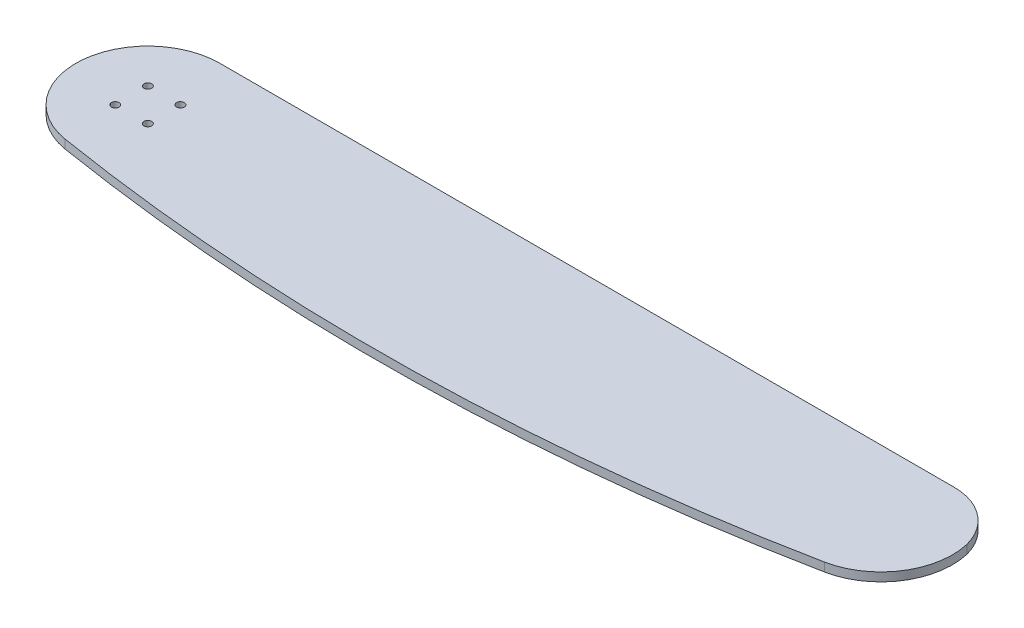
ISO-10303-21;
HEADER;
FILE_DESCRIPTION(('STEP AP214'),'2;1');
FILE_NAME('part.step','',(''),(''),'','','');
FILE_SCHEMA(('AUTOMOTIVE_DESIGN { 1 0 10303 214 1 1 1 1 }'));
ENDSEC;
DATA;
#1=APPLICATION_CONTEXT('core data for automotive mechanical design processes');
#2=APPLICATION_PROTOCOL_DEFINITION('international standard','automotive_design',2000,#1);
#3=PRODUCT_CONTEXT('',#1,'mechanical');
#4=PRODUCT('Part','Part','',(#3));
#5=PRODUCT_RELATED_PRODUCT_CATEGORY('part','',(#4));
#6=PRODUCT_DEFINITION_FORMATION('','',#4);
#7=PRODUCT_DEFINITION_CONTEXT('part definition',#1,'design');
#8=PRODUCT_DEFINITION('design','',#6,#7);
#9=PRODUCT_DEFINITION_SHAPE('','',#8);
#10=(LENGTH_UNIT() NAMED_UNIT(*) SI_UNIT(.MILLI.,.METRE.));
#11=(NAMED_UNIT(*) PLANE_ANGLE_UNIT() SI_UNIT($,.RADIAN.));
#12=(NAMED_UNIT(*) SI_UNIT($,.STERADIAN.) SOLID_ANGLE_UNIT());
#13=UNCERTAINTY_MEASURE_WITH_UNIT(LENGTH_MEASURE(1.E-05),#10,'distance_accuracy_value','');
#14=(GEOMETRIC_REPRESENTATION_CONTEXT(3) GLOBAL_UNCERTAINTY_ASSIGNED_CONTEXT((#13)) GLOBAL_UNIT_ASSIGNED_CONTEXT((#10,
#11,#12)) REPRESENTATION_CONTEXT('',''));
#15=CARTESIAN_POINT('',(0.,0.,0.));
#16=DIRECTION('',(0.,0.,1.));
#17=DIRECTION('',(1.,0.,0.));
#18=AXIS2_PLACEMENT_3D('',#15,#16,#17);
#19=CARTESIAN_POINT('',(0.,3.,-50.));
#20=DIRECTION('',(0.,0.,-1.));
#21=DIRECTION('',(-1.,0.,0.));
#22=AXIS2_PLACEMENT_3D('',#19,#20,#21);
#23=PLANE('',#22);
#24=DIRECTION('',(1.,0.,0.));
#25=VECTOR('',#24,1.);
#26=CARTESIAN_POINT('',(0.,0.,-50.));
#27=LINE('',#26,#25);
#28=CARTESIAN_POINT('',(25.,0.,-50.));
#29=VERTEX_POINT('',#28);
#30=CARTESIAN_POINT('',(280.,0.,-50.));
#31=VERTEX_POINT('',#30);
#32=EDGE_CURVE('E129',#29,#31,#27,.T.);
#33=ORIENTED_EDGE('',*,*,#32,.F.);
#34=DIRECTION('',(0.,-1.,0.));
#35=VECTOR('',#34,1.);
#36=CARTESIAN_POINT('',(25.,3.,-50.));
#37=LINE('',#36,#35);
#38=CARTESIAN_POINT('',(25.,3.,-50.));
#39=VERTEX_POINT('',#38);
#40=EDGE_CURVE('E11',#39,#29,#37,.T.);
#41=ORIENTED_EDGE('',*,*,#40,.F.);
#42=DIRECTION('',(1.,0.,0.));
#43=VECTOR('',#42,1.);
#44=CARTESIAN_POINT('',(0.,3.,-50.));
#45=LINE('',#44,#43);
#46=CARTESIAN_POINT('',(280.,3.,-50.));
#47=VERTEX_POINT('',#46);
#48=EDGE_CURVE('E151',#39,#47,#45,.T.);
#49=ORIENTED_EDGE('',*,*,#48,.T.);
#50=DIRECTION('',(0.,-1.,0.));
#51=VECTOR('',#50,1.);
#52=CARTESIAN_POINT('',(280.,3.,-50.));
#53=LINE('',#52,#51);
#54=EDGE_CURVE('E58',#47,#31,#53,.T.);
#55=ORIENTED_EDGE('',*,*,#54,.T.);
#56=EDGE_LOOP('',(#33,#41,#49,#55));
#57=FACE_BOUND('',#56,.T.);
#58=ADVANCED_FACE('F42',(#57),#23,.T.);
#59=CARTESIAN_POINT('',(25.,3.,-25.));
#60=DIRECTION('',(0.,-1.,0.));
#61=DIRECTION('',(0.,0.,-1.));
#62=AXIS2_PLACEMENT_3D('',#59,#60,#61);
#63=CYLINDRICAL_SURFACE('',#62,25.);
#64=CARTESIAN_POINT('',(25.,0.,-25.));
#65=DIRECTION('',(0.,1.,0.));
#66=DIRECTION('',(0.,0.,1.));
#67=AXIS2_PLACEMENT_3D('',#64,#65,#66);
#68=CIRCLE('',#67,25.);
#69=CARTESIAN_POINT('',(21.,0.,-0.32207464149387));
#70=VERTEX_POINT('',#69);
#71=EDGE_CURVE('E131',#29,#70,#68,.T.);
#72=ORIENTED_EDGE('',*,*,#71,.T.);
#73=DIRECTION('',(0.,-1.,0.));
#74=VECTOR('',#73,1.);
#75=CARTESIAN_POINT('',(21.,3.,-0.32207464149387));
#76=LINE('',#75,#74);
#77=CARTESIAN_POINT('',(21.,3.,-0.32207464149387));
#78=VERTEX_POINT('',#77);
#79=EDGE_CURVE('E50',#78,#70,#76,.T.);
#80=ORIENTED_EDGE('',*,*,#79,.F.);
#81=CARTESIAN_POINT('',(25.,3.,-25.));
#82=DIRECTION('',(0.,1.,0.));
#83=DIRECTION('',(0.,0.,1.));
#84=AXIS2_PLACEMENT_3D('',#81,#82,#83);
#85=CIRCLE('',#84,25.);
#86=EDGE_CURVE('E98',#39,#78,#85,.T.);
#87=ORIENTED_EDGE('',*,*,#86,.F.);
#88=ORIENTED_EDGE('',*,*,#40,.T.);
#89=EDGE_LOOP('',(#72,#80,#87,#88));
#90=FACE_BOUND('',#89,.T.);
#91=ADVANCED_FACE('F174',(#90),#63,.T.);
#92=CARTESIAN_POINT('',(137.554568171314,3.,-719.403308022645));
#93=DIRECTION('',(0.,-1.,0.));
#94=DIRECTION('',(0.,0.,-1.));
#95=AXIS2_PLACEMENT_3D('',#92,#93,#94);
#96=CYLINDRICAL_SURFACE('',#95,728.466051070713);
#97=CARTESIAN_POINT('',(137.554568171314,0.,-719.403308022645));
#98=DIRECTION('',(0.,1.,0.));
#99=DIRECTION('',(0.,0.,1.));
#100=AXIS2_PLACEMENT_3D('',#97,#98,#99);
#101=CIRCLE('',#100,728.466051070713);
#102=CARTESIAN_POINT('',(280.,0.,-4.99999999999997));
#103=VERTEX_POINT('',#102);
#104=EDGE_CURVE('E107',#70,#103,#101,.T.);
#105=ORIENTED_EDGE('',*,*,#104,.T.);
#106=DIRECTION('',(0.,-1.,0.));
#107=VECTOR('',#106,1.);
#108=CARTESIAN_POINT('',(280.,3.,-4.99999999999997));
#109=LINE('',#108,#107);
#110=CARTESIAN_POINT('',(280.,3.,-4.99999999999997));
#111=VERTEX_POINT('',#110);
#112=EDGE_CURVE('E104',#111,#103,#109,.T.);
#113=ORIENTED_EDGE('',*,*,#112,.F.);
#114=CARTESIAN_POINT('',(137.554568171314,3.,-719.403308022645));
#115=DIRECTION('',(0.,1.,0.));
#116=DIRECTION('',(0.,0.,1.));
#117=AXIS2_PLACEMENT_3D('',#114,#115,#116);
#118=CIRCLE('',#117,728.466051070713);
#119=EDGE_CURVE('E90',#78,#111,#118,.T.);
#120=ORIENTED_EDGE('',*,*,#119,.F.);
#121=ORIENTED_EDGE('',*,*,#79,.T.);
#122=EDGE_LOOP('',(#105,#113,#120,#121));
#123=FACE_BOUND('',#122,.T.);
#124=ADVANCED_FACE('F105',(#123),#96,.T.);
#125=CARTESIAN_POINT('',(275.138552223199,3.,-29.3815075635621));
#126=DIRECTION('',(0.,-1.,0.));
#127=DIRECTION('',(0.,0.,-1.));
#128=AXIS2_PLACEMENT_3D('',#125,#126,#127);
#129=CYLINDRICAL_SURFACE('',#128,24.8614477768009);
#130=CARTESIAN_POINT('',(275.138552223199,0.,-29.3815075635621));
#131=DIRECTION('',(0.,1.,0.));
#132=DIRECTION('',(0.,0.,1.));
#133=AXIS2_PLACEMENT_3D('',#130,#131,#132);
#134=CIRCLE('',#133,24.8614477768009);
#135=CARTESIAN_POINT('',(299.356812447672,0.,-34.9999999999999));
#136=VERTEX_POINT('',#135);
#137=EDGE_CURVE('E134',#136,#103,#134,.F.);
#138=ORIENTED_EDGE('',*,*,#137,.F.);
#139=DIRECTION('',(0.,-1.,0.));
#140=VECTOR('',#139,1.);
#141=CARTESIAN_POINT('',(299.356812447672,3.,-34.9999999999999));
#142=LINE('',#141,#140);
#143=CARTESIAN_POINT('',(299.356812447672,3.,-34.9999999999999));
#144=VERTEX_POINT('',#143);
#145=EDGE_CURVE('E74',#144,#136,#142,.T.);
#146=ORIENTED_EDGE('',*,*,#145,.F.);
#147=CARTESIAN_POINT('',(275.138552223199,3.,-29.3815075635621));
#148=DIRECTION('',(0.,1.,0.));
#149=DIRECTION('',(0.,0.,1.));
#150=AXIS2_PLACEMENT_3D('',#147,#148,#149);
#151=CIRCLE('',#150,24.8614477768009);
#152=EDGE_CURVE('E97',#144,#111,#151,.F.);
#153=ORIENTED_EDGE('',*,*,#152,.T.);
#154=ORIENTED_EDGE('',*,*,#112,.T.);
#155=EDGE_LOOP('',(#138,#146,#153,#154));
#156=FACE_BOUND('',#155,.T.);
#157=ADVANCED_FACE('F111',(#156),#129,.T.);
#158=CARTESIAN_POINT('',(30.6568542494924,3.,-30.6568542494923));
#159=DIRECTION('',(0.,-1.,0.));
#160=DIRECTION('',(0.,0.,-1.));
#161=AXIS2_PLACEMENT_3D('',#158,#159,#160);
#162=CYLINDRICAL_SURFACE('',#161,1.35);
#163=CARTESIAN_POINT('',(30.6568542494924,3.,-30.6568542494923));
#164=DIRECTION('',(0.,1.,0.));
#165=DIRECTION('',(0.,0.,1.));
#166=AXIS2_PLACEMENT_3D('',#163,#164,#165);
#167=CIRCLE('',#166,1.35);
#168=CARTESIAN_POINT('',(30.6568542494924,3.,-29.3068542494923));
#169=VERTEX_POINT('',#168);
#170=EDGE_CURVE('E123',#169,#169,#167,.T.);
#171=ORIENTED_EDGE('',*,*,#170,.T.);
#172=EDGE_LOOP('',(#171));
#173=FACE_BOUND('',#172,.T.);
#174=CARTESIAN_POINT('',(30.6568542494924,0.,-30.6568542494923));
#175=DIRECTION('',(0.,1.,0.));
#176=DIRECTION('',(0.,0.,1.));
#177=AXIS2_PLACEMENT_3D('',#174,#175,#176);
#178=CIRCLE('',#177,1.35);
#179=CARTESIAN_POINT('',(30.6568542494924,0.,-29.3068542494923));
#180=VERTEX_POINT('',#179);
#181=EDGE_CURVE('E145',#180,#180,#178,.T.);
#182=ORIENTED_EDGE('',*,*,#181,.F.);
#183=EDGE_LOOP('',(#182));
#184=FACE_BOUND('',#183,.T.);
#185=ADVANCED_FACE('F183',(#173,#184),#162,.F.);
#186=CARTESIAN_POINT('',(30.6568542494924,3.,-19.3431457505075));
#187=DIRECTION('',(0.,-1.,0.));
#188=DIRECTION('',(0.,0.,-1.));
#189=AXIS2_PLACEMENT_3D('',#186,#187,#188);
#190=CYLINDRICAL_SURFACE('',#189,1.35);
#191=CARTESIAN_POINT('',(30.6568542494924,3.,-19.3431457505075));
#192=DIRECTION('',(0.,1.,0.));
#193=DIRECTION('',(0.,0.,1.));
#194=AXIS2_PLACEMENT_3D('',#191,#192,#193);
#195=CIRCLE('',#194,1.35);
#196=CARTESIAN_POINT('',(30.6568542494924,3.,-17.9931457505075));
#197=VERTEX_POINT('',#196);
#198=EDGE_CURVE('E120',#197,#197,#195,.T.);
#199=ORIENTED_EDGE('',*,*,#198,.T.);
#200=EDGE_LOOP('',(#199));
#201=FACE_BOUND('',#200,.T.);
#202=CARTESIAN_POINT('',(30.6568542494924,0.,-19.3431457505075));
#203=DIRECTION('',(0.,1.,0.));
#204=DIRECTION('',(0.,0.,1.));
#205=AXIS2_PLACEMENT_3D('',#202,#203,#204);
#206=CIRCLE('',#205,1.35);
#207=CARTESIAN_POINT('',(30.6568542494924,0.,-17.9931457505075));
#208=VERTEX_POINT('',#207);
#209=EDGE_CURVE('E142',#208,#208,#206,.T.);
#210=ORIENTED_EDGE('',*,*,#209,.F.);
#211=EDGE_LOOP('',(#210));
#212=FACE_BOUND('',#211,.T.);
#213=ADVANCED_FACE('F169',(#201,#212),#190,.F.);
#214=CARTESIAN_POINT('',(19.3431457505076,3.,-19.3431457505075));
#215=DIRECTION('',(0.,-1.,0.));
#216=DIRECTION('',(0.,0.,-1.));
#217=AXIS2_PLACEMENT_3D('',#214,#215,#216);
#218=CYLINDRICAL_SURFACE('',#217,1.35);
#219=CARTESIAN_POINT('',(19.3431457505076,3.,-19.3431457505075));
#220=DIRECTION('',(0.,1.,0.));
#221=DIRECTION('',(0.,0.,1.));
#222=AXIS2_PLACEMENT_3D('',#219,#220,#221);
#223=CIRCLE('',#222,1.35);
#224=CARTESIAN_POINT('',(19.3431457505076,3.,-17.9931457505075));
#225=VERTEX_POINT('',#224);
#226=EDGE_CURVE('E114',#225,#225,#223,.T.);
#227=ORIENTED_EDGE('',*,*,#226,.T.);
#228=EDGE_LOOP('',(#227));
#229=FACE_BOUND('',#228,.T.);
#230=CARTESIAN_POINT('',(19.3431457505076,0.,-19.3431457505075));
#231=DIRECTION('',(0.,1.,0.));
#232=DIRECTION('',(0.,0.,1.));
#233=AXIS2_PLACEMENT_3D('',#230,#231,#232);
#234=CIRCLE('',#233,1.35);
#235=CARTESIAN_POINT('',(19.3431457505076,0.,-17.9931457505075));
#236=VERTEX_POINT('',#235);
#237=EDGE_CURVE('E139',#236,#236,#234,.T.);
#238=ORIENTED_EDGE('',*,*,#237,.F.);
#239=EDGE_LOOP('',(#238));
#240=FACE_BOUND('',#239,.T.);
#241=ADVANCED_FACE('F161',(#229,#240),#218,.F.);
#242=CARTESIAN_POINT('',(280.,3.,-30.0104603955217));
#243=DIRECTION('',(0.,-1.,0.));
#244=DIRECTION('',(0.,0.,-1.));
#245=AXIS2_PLACEMENT_3D('',#242,#243,#244);
#246=CYLINDRICAL_SURFACE('',#245,19.9895396044783);
#247=CARTESIAN_POINT('',(280.,0.,-30.0104603955217));
#248=DIRECTION('',(0.,1.,0.));
#249=DIRECTION('',(0.,0.,1.));
#250=AXIS2_PLACEMENT_3D('',#247,#248,#249);
#251=CIRCLE('',#250,19.9895396044783);
#252=EDGE_CURVE('E136',#31,#136,#251,.F.);
#253=ORIENTED_EDGE('',*,*,#252,.F.);
#254=ORIENTED_EDGE('',*,*,#54,.F.);
#255=CARTESIAN_POINT('',(280.,3.,-30.0104603955217));
#256=DIRECTION('',(0.,1.,0.));
#257=DIRECTION('',(0.,0.,1.));
#258=AXIS2_PLACEMENT_3D('',#255,#256,#257);
#259=CIRCLE('',#258,19.9895396044783);
#260=EDGE_CURVE('E112',#47,#144,#259,.F.);
#261=ORIENTED_EDGE('',*,*,#260,.T.);
#262=ORIENTED_EDGE('',*,*,#145,.T.);
#263=EDGE_LOOP('',(#253,#254,#261,#262));
#264=FACE_BOUND('',#263,.T.);
#265=ADVANCED_FACE('F158',(#264),#246,.T.);
#266=CARTESIAN_POINT('',(19.3431457505076,3.,-30.6568542494923));
#267=DIRECTION('',(0.,-1.,0.));
#268=DIRECTION('',(0.,0.,-1.));
#269=AXIS2_PLACEMENT_3D('',#266,#267,#268);
#270=CYLINDRICAL_SURFACE('',#269,1.35);
#271=CARTESIAN_POINT('',(19.3431457505076,3.,-30.6568542494923));
#272=DIRECTION('',(0.,1.,0.));
#273=DIRECTION('',(0.,0.,1.));
#274=AXIS2_PLACEMENT_3D('',#271,#272,#273);
#275=CIRCLE('',#274,1.35);
#276=CARTESIAN_POINT('',(19.3431457505076,3.,-29.3068542494923));
#277=VERTEX_POINT('',#276);
#278=EDGE_CURVE('E126',#277,#277,#275,.T.);
#279=ORIENTED_EDGE('',*,*,#278,.T.);
#280=EDGE_LOOP('',(#279));
#281=FACE_BOUND('',#280,.T.);
#282=CARTESIAN_POINT('',(19.3431457505076,0.,-30.6568542494923));
#283=DIRECTION('',(0.,1.,0.));
#284=DIRECTION('',(0.,0.,1.));
#285=AXIS2_PLACEMENT_3D('',#282,#283,#284);
#286=CIRCLE('',#285,1.35);
#287=CARTESIAN_POINT('',(19.3431457505076,0.,-29.3068542494923));
#288=VERTEX_POINT('',#287);
#289=EDGE_CURVE('E148',#288,#288,#286,.T.);
#290=ORIENTED_EDGE('',*,*,#289,.F.);
#291=EDGE_LOOP('',(#290));
#292=FACE_BOUND('',#291,.T.);
#293=ADVANCED_FACE('F160',(#281,#292),#270,.F.);
#294=CARTESIAN_POINT('',(0.,3.,0.));
#295=DIRECTION('',(0.,1.,0.));
#296=DIRECTION('',(0.,0.,1.));
#297=AXIS2_PLACEMENT_3D('',#294,#295,#296);
#298=PLANE('',#297);
#299=ORIENTED_EDGE('',*,*,#48,.F.);
#300=ORIENTED_EDGE('',*,*,#86,.T.);
#301=ORIENTED_EDGE('',*,*,#119,.T.);
#302=ORIENTED_EDGE('',*,*,#152,.F.);
#303=ORIENTED_EDGE('',*,*,#260,.F.);
#304=EDGE_LOOP('',(#299,#300,#301,#302,#303));
#305=FACE_BOUND('',#304,.T.);
#306=ORIENTED_EDGE('',*,*,#226,.F.);
#307=EDGE_LOOP('',(#306));
#308=FACE_BOUND('',#307,.T.);
#309=ORIENTED_EDGE('',*,*,#198,.F.);
#310=EDGE_LOOP('',(#309));
#311=FACE_BOUND('',#310,.T.);
#312=ORIENTED_EDGE('',*,*,#170,.F.);
#313=EDGE_LOOP('',(#312));
#314=FACE_BOUND('',#313,.T.);
#315=ORIENTED_EDGE('',*,*,#278,.F.);
#316=EDGE_LOOP('',(#315));
#317=FACE_BOUND('',#316,.T.);
#318=ADVANCED_FACE('F93',(#305,#308,#311,#314,#317),#298,.T.);
#319=CARTESIAN_POINT('',(0.,0.,0.));
#320=DIRECTION('',(0.,1.,0.));
#321=DIRECTION('',(0.,0.,1.));
#322=AXIS2_PLACEMENT_3D('',#319,#320,#321);
#323=PLANE('',#322);
#324=ORIENTED_EDGE('',*,*,#32,.T.);
#325=ORIENTED_EDGE('',*,*,#252,.T.);
#326=ORIENTED_EDGE('',*,*,#137,.T.);
#327=ORIENTED_EDGE('',*,*,#104,.F.);
#328=ORIENTED_EDGE('',*,*,#71,.F.);
#329=EDGE_LOOP('',(#324,#325,#326,#327,#328));
#330=FACE_BOUND('',#329,.T.);
#331=ORIENTED_EDGE('',*,*,#237,.T.);
#332=EDGE_LOOP('',(#331));
#333=FACE_BOUND('',#332,.T.);
#334=ORIENTED_EDGE('',*,*,#209,.T.);
#335=EDGE_LOOP('',(#334));
#336=FACE_BOUND('',#335,.T.);
#337=ORIENTED_EDGE('',*,*,#181,.T.);
#338=EDGE_LOOP('',(#337));
#339=FACE_BOUND('',#338,.T.);
#340=ORIENTED_EDGE('',*,*,#289,.T.);
#341=EDGE_LOOP('',(#340));
#342=FACE_BOUND('',#341,.T.);
#343=ADVANCED_FACE('F156',(#330,#333,#336,#339,#342),#323,.F.);
#344=CLOSED_SHELL('',(#58,#91,#124,#157,#185,#213,#241,#265,#293,#318,#343));
#345=MANIFOLD_SOLID_BREP('B2',#344);
#346=ADVANCED_BREP_SHAPE_REPRESENTATION('',(#18,#345),#14);
#347=SHAPE_DEFINITION_REPRESENTATION(#9,#346);
ENDSEC;
END-ISO-10303-21;
